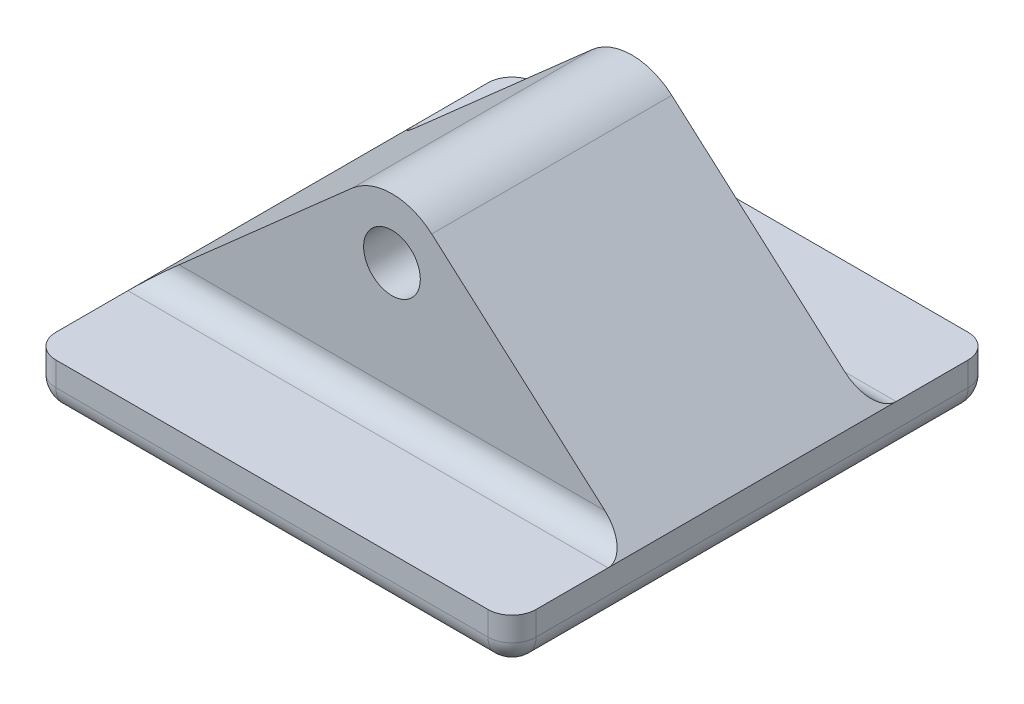
ISO-10303-21;
HEADER;
FILE_DESCRIPTION(('STEP AP214'),'2;1');
FILE_NAME('part.step','',(''),(''),'','','');
FILE_SCHEMA(('AUTOMOTIVE_DESIGN { 1 0 10303 214 1 1 1 1 }'));
ENDSEC;
DATA;
#1=APPLICATION_CONTEXT('core data for automotive mechanical design processes');
#2=APPLICATION_PROTOCOL_DEFINITION('international standard','automotive_design',2000,#1);
#3=PRODUCT_CONTEXT('',#1,'mechanical');
#4=PRODUCT('Part','Part','',(#3));
#5=PRODUCT_RELATED_PRODUCT_CATEGORY('part','',(#4));
#6=PRODUCT_DEFINITION_FORMATION('','',#4);
#7=PRODUCT_DEFINITION_CONTEXT('part definition',#1,'design');
#8=PRODUCT_DEFINITION('design','',#6,#7);
#9=PRODUCT_DEFINITION_SHAPE('','',#8);
#10=(LENGTH_UNIT() NAMED_UNIT(*) SI_UNIT(.MILLI.,.METRE.));
#11=(NAMED_UNIT(*) PLANE_ANGLE_UNIT() SI_UNIT($,.RADIAN.));
#12=(NAMED_UNIT(*) SI_UNIT($,.STERADIAN.) SOLID_ANGLE_UNIT());
#13=UNCERTAINTY_MEASURE_WITH_UNIT(LENGTH_MEASURE(1.E-05),#10,'distance_accuracy_value','');
#14=(GEOMETRIC_REPRESENTATION_CONTEXT(3) GLOBAL_UNCERTAINTY_ASSIGNED_CONTEXT((#13)) GLOBAL_UNIT_ASSIGNED_CONTEXT((#10,
#11,#12)) REPRESENTATION_CONTEXT('',''));
#15=CARTESIAN_POINT('',(0.,0.,0.));
#16=DIRECTION('',(0.,0.,1.));
#17=DIRECTION('',(1.,0.,0.));
#18=AXIS2_PLACEMENT_3D('',#15,#16,#17);
#19=CARTESIAN_POINT('',(0.,2.54,0.));
#20=DIRECTION('',(0.,-1.,0.));
#21=DIRECTION('',(0.,0.,-1.));
#22=AXIS2_PLACEMENT_3D('',#19,#20,#21);
#23=PLANE('',#22);
#24=DIRECTION('',(0.,0.,1.));
#25=VECTOR('',#24,1.);
#26=CARTESIAN_POINT('',(-12.7,2.54,12.7));
#27=LINE('',#26,#25);
#28=CARTESIAN_POINT('',(-12.7,2.54,7.62));
#29=VERTEX_POINT('',#28);
#30=CARTESIAN_POINT('',(-12.7,2.54,11.43));
#31=VERTEX_POINT('',#30);
#32=EDGE_CURVE('E317',#29,#31,#27,.T.);
#33=ORIENTED_EDGE('',*,*,#32,.T.);
#34=CARTESIAN_POINT('',(-11.43,2.54,11.43));
#35=DIRECTION('',(0.,-1.,0.));
#36=DIRECTION('',(0.,0.,-1.));
#37=AXIS2_PLACEMENT_3D('',#34,#35,#36);
#38=CIRCLE('',#37,1.27);
#39=CARTESIAN_POINT('',(-11.43,2.54,12.7));
#40=VERTEX_POINT('',#39);
#41=EDGE_CURVE('E283',#31,#40,#38,.F.);
#42=ORIENTED_EDGE('',*,*,#41,.T.);
#43=DIRECTION('',(1.,0.,0.));
#44=VECTOR('',#43,1.);
#45=CARTESIAN_POINT('',(-12.7,2.54,12.7));
#46=LINE('',#45,#44);
#47=CARTESIAN_POINT('',(11.43,2.54,12.7));
#48=VERTEX_POINT('',#47);
#49=EDGE_CURVE('E193',#40,#48,#46,.T.);
#50=ORIENTED_EDGE('',*,*,#49,.T.);
#51=CARTESIAN_POINT('',(11.43,2.54,11.43));
#52=DIRECTION('',(0.,-1.,0.));
#53=DIRECTION('',(0.,0.,-1.));
#54=AXIS2_PLACEMENT_3D('',#51,#52,#53);
#55=CIRCLE('',#54,1.27);
#56=CARTESIAN_POINT('',(12.7,2.54,11.43));
#57=VERTEX_POINT('',#56);
#58=EDGE_CURVE('E285',#48,#57,#55,.F.);
#59=ORIENTED_EDGE('',*,*,#58,.T.);
#60=DIRECTION('',(0.,0.,-1.));
#61=VECTOR('',#60,1.);
#62=CARTESIAN_POINT('',(12.7,2.54,12.7));
#63=LINE('',#62,#61);
#64=CARTESIAN_POINT('',(12.7,2.54,7.62));
#65=VERTEX_POINT('',#64);
#66=EDGE_CURVE('E297',#57,#65,#63,.T.);
#67=ORIENTED_EDGE('',*,*,#66,.T.);
#68=DIRECTION('',(1.,0.,0.));
#69=VECTOR('',#68,1.);
#70=CARTESIAN_POINT('',(-12.7,2.54,7.62));
#71=LINE('',#70,#69);
#72=EDGE_CURVE('E287',#65,#29,#71,.F.);
#73=ORIENTED_EDGE('',*,*,#72,.T.);
#74=EDGE_LOOP('',(#33,#42,#50,#59,#67,#73));
#75=FACE_BOUND('',#74,.T.);
#76=ADVANCED_FACE('F53',(#75),#23,.F.);
#77=DIRECTION('',(-1.,0.,0.));
#78=VECTOR('',#77,1.);
#79=CARTESIAN_POINT('',(-12.7,2.54,-12.7));
#80=LINE('',#79,#78);
#81=CARTESIAN_POINT('',(11.43,2.54,-12.7));
#82=VERTEX_POINT('',#81);
#83=CARTESIAN_POINT('',(-11.43,2.54,-12.7));
#84=VERTEX_POINT('',#83);
#85=EDGE_CURVE('E299',#82,#84,#80,.T.);
#86=ORIENTED_EDGE('',*,*,#85,.T.);
#87=CARTESIAN_POINT('',(-11.43,2.54,-11.43));
#88=DIRECTION('',(0.,-1.,0.));
#89=DIRECTION('',(0.,0.,-1.));
#90=AXIS2_PLACEMENT_3D('',#87,#88,#89);
#91=CIRCLE('',#90,1.27);
#92=CARTESIAN_POINT('',(-12.7,2.54,-11.43));
#93=VERTEX_POINT('',#92);
#94=EDGE_CURVE('E276',#84,#93,#91,.F.);
#95=ORIENTED_EDGE('',*,*,#94,.T.);
#96=CARTESIAN_POINT('',(-12.7,2.54,-7.62));
#97=VERTEX_POINT('',#96);
#98=EDGE_CURVE('E314',#93,#97,#27,.T.);
#99=ORIENTED_EDGE('',*,*,#98,.T.);
#100=DIRECTION('',(-1.,0.,0.));
#101=VECTOR('',#100,1.);
#102=CARTESIAN_POINT('',(12.7,2.54,-7.62));
#103=LINE('',#102,#101);
#104=CARTESIAN_POINT('',(12.7,2.54,-7.62));
#105=VERTEX_POINT('',#104);
#106=EDGE_CURVE('E280',#97,#105,#103,.F.);
#107=ORIENTED_EDGE('',*,*,#106,.T.);
#108=CARTESIAN_POINT('',(12.7,2.54,-11.43));
#109=VERTEX_POINT('',#108);
#110=EDGE_CURVE('E275',#105,#109,#63,.T.);
#111=ORIENTED_EDGE('',*,*,#110,.T.);
#112=CARTESIAN_POINT('',(11.43,2.54,-11.43));
#113=DIRECTION('',(0.,-1.,0.));
#114=DIRECTION('',(0.,0.,-1.));
#115=AXIS2_PLACEMENT_3D('',#112,#113,#114);
#116=CIRCLE('',#115,1.27);
#117=EDGE_CURVE('E278',#109,#82,#116,.F.);
#118=ORIENTED_EDGE('',*,*,#117,.T.);
#119=EDGE_LOOP('',(#86,#95,#99,#107,#111,#118));
#120=FACE_BOUND('',#119,.T.);
#121=ADVANCED_FACE('F395',(#120),#23,.F.);
#122=CARTESIAN_POINT('',(12.7,2.54,12.7));
#123=DIRECTION('',(-1.,0.,0.));
#124=DIRECTION('',(0.,0.,1.));
#125=AXIS2_PLACEMENT_3D('',#122,#123,#124);
#126=PLANE('',#125);
#127=ORIENTED_EDGE('',*,*,#66,.F.);
#128=DIRECTION('',(0.,-1.,0.));
#129=VECTOR('',#128,1.);
#130=CARTESIAN_POINT('',(12.7,2.54,11.43));
#131=LINE('',#130,#129);
#132=CARTESIAN_POINT('',(12.7,1.27,11.43));
#133=VERTEX_POINT('',#132);
#134=EDGE_CURVE('E290',#57,#133,#131,.T.);
#135=ORIENTED_EDGE('',*,*,#134,.T.);
#136=DIRECTION('',(0.,0.,-1.));
#137=VECTOR('',#136,1.);
#138=CARTESIAN_POINT('',(12.7,1.27,-12.7));
#139=LINE('',#138,#137);
#140=CARTESIAN_POINT('',(12.7,1.27,-11.43));
#141=VERTEX_POINT('',#140);
#142=EDGE_CURVE('E292',#133,#141,#139,.T.);
#143=ORIENTED_EDGE('',*,*,#142,.T.);
#144=DIRECTION('',(0.,-1.,0.));
#145=VECTOR('',#144,1.);
#146=CARTESIAN_POINT('',(12.7,2.54,-11.43));
#147=LINE('',#146,#145);
#148=EDGE_CURVE('E294',#141,#109,#147,.F.);
#149=ORIENTED_EDGE('',*,*,#148,.T.);
#150=ORIENTED_EDGE('',*,*,#110,.F.);
#151=DIRECTION('',(0.,0.,1.));
#152=VECTOR('',#151,1.);
#153=CARTESIAN_POINT('',(12.7,2.54,-12.700025));
#154=LINE('',#153,#152);
#155=EDGE_CURVE('E71',#105,#65,#154,.T.);
#156=ORIENTED_EDGE('',*,*,#155,.T.);
#157=EDGE_LOOP('',(#127,#135,#143,#149,#150,#156));
#158=FACE_BOUND('',#157,.T.);
#159=ADVANCED_FACE('F385',(#158),#126,.F.);
#160=CARTESIAN_POINT('',(-12.7,2.54,-12.7));
#161=DIRECTION('',(0.,0.,1.));
#162=DIRECTION('',(1.,0.,0.));
#163=AXIS2_PLACEMENT_3D('',#160,#161,#162);
#164=PLANE('',#163);
#165=DIRECTION('',(-1.,0.,0.));
#166=VECTOR('',#165,1.);
#167=CARTESIAN_POINT('',(-12.7,1.27,-12.7));
#168=LINE('',#167,#166);
#169=CARTESIAN_POINT('',(11.43,1.27,-12.7));
#170=VERTEX_POINT('',#169);
#171=CARTESIAN_POINT('',(-11.43,1.27,-12.7));
#172=VERTEX_POINT('',#171);
#173=EDGE_CURVE('E377',#170,#172,#168,.T.);
#174=ORIENTED_EDGE('',*,*,#173,.T.);
#175=DIRECTION('',(0.,-1.,0.));
#176=VECTOR('',#175,1.);
#177=CARTESIAN_POINT('',(-11.43,2.54,-12.7));
#178=LINE('',#177,#176);
#179=EDGE_CURVE('E354',#172,#84,#178,.F.);
#180=ORIENTED_EDGE('',*,*,#179,.T.);
#181=ORIENTED_EDGE('',*,*,#85,.F.);
#182=DIRECTION('',(0.,-1.,0.));
#183=VECTOR('',#182,1.);
#184=CARTESIAN_POINT('',(11.43,2.54,-12.7));
#185=LINE('',#184,#183);
#186=EDGE_CURVE('E199',#82,#170,#185,.T.);
#187=ORIENTED_EDGE('',*,*,#186,.T.);
#188=EDGE_LOOP('',(#174,#180,#181,#187));
#189=FACE_BOUND('',#188,.T.);
#190=ADVANCED_FACE('F378',(#189),#164,.F.);
#191=CARTESIAN_POINT('',(-12.7,2.54,12.7));
#192=DIRECTION('',(1.,0.,0.));
#193=DIRECTION('',(0.,0.,-1.));
#194=AXIS2_PLACEMENT_3D('',#191,#192,#193);
#195=PLANE('',#194);
#196=DIRECTION('',(0.,0.,1.));
#197=VECTOR('',#196,1.);
#198=CARTESIAN_POINT('',(-12.7,1.27,12.7));
#199=LINE('',#198,#197);
#200=CARTESIAN_POINT('',(-12.7,1.27,-11.43));
#201=VERTEX_POINT('',#200);
#202=CARTESIAN_POINT('',(-12.7,1.27,11.43));
#203=VERTEX_POINT('',#202);
#204=EDGE_CURVE('E309',#201,#203,#199,.T.);
#205=ORIENTED_EDGE('',*,*,#204,.T.);
#206=DIRECTION('',(0.,-1.,0.));
#207=VECTOR('',#206,1.);
#208=CARTESIAN_POINT('',(-12.7,2.54,11.43));
#209=LINE('',#208,#207);
#210=EDGE_CURVE('E307',#203,#31,#209,.F.);
#211=ORIENTED_EDGE('',*,*,#210,.T.);
#212=ORIENTED_EDGE('',*,*,#32,.F.);
#213=DIRECTION('',(0.,0.,1.));
#214=VECTOR('',#213,1.);
#215=CARTESIAN_POINT('',(-12.7,2.54,-12.700025));
#216=LINE('',#215,#214);
#217=EDGE_CURVE('E260',#97,#29,#216,.T.);
#218=ORIENTED_EDGE('',*,*,#217,.F.);
#219=ORIENTED_EDGE('',*,*,#98,.F.);
#220=DIRECTION('',(0.,-1.,0.));
#221=VECTOR('',#220,1.);
#222=CARTESIAN_POINT('',(-12.7,2.54,-11.43));
#223=LINE('',#222,#221);
#224=EDGE_CURVE('E311',#93,#201,#223,.T.);
#225=ORIENTED_EDGE('',*,*,#224,.T.);
#226=EDGE_LOOP('',(#205,#211,#212,#218,#219,#225));
#227=FACE_BOUND('',#226,.T.);
#228=ADVANCED_FACE('F394',(#227),#195,.F.);
#229=CARTESIAN_POINT('',(-12.7,2.54,12.7));
#230=DIRECTION('',(0.,0.,-1.));
#231=DIRECTION('',(-1.,0.,0.));
#232=AXIS2_PLACEMENT_3D('',#229,#230,#231);
#233=PLANE('',#232);
#234=ORIENTED_EDGE('',*,*,#49,.F.);
#235=DIRECTION('',(0.,-1.,0.));
#236=VECTOR('',#235,1.);
#237=CARTESIAN_POINT('',(-11.43,2.54,12.7));
#238=LINE('',#237,#236);
#239=CARTESIAN_POINT('',(-11.43,1.27,12.7));
#240=VERTEX_POINT('',#239);
#241=EDGE_CURVE('E296',#40,#240,#238,.T.);
#242=ORIENTED_EDGE('',*,*,#241,.T.);
#243=DIRECTION('',(1.,0.,0.));
#244=VECTOR('',#243,1.);
#245=CARTESIAN_POINT('',(12.7,1.27,12.7));
#246=LINE('',#245,#244);
#247=CARTESIAN_POINT('',(11.43,1.27,12.7));
#248=VERTEX_POINT('',#247);
#249=EDGE_CURVE('E303',#240,#248,#246,.T.);
#250=ORIENTED_EDGE('',*,*,#249,.T.);
#251=DIRECTION('',(0.,-1.,0.));
#252=VECTOR('',#251,1.);
#253=CARTESIAN_POINT('',(11.43,2.54,12.7));
#254=LINE('',#253,#252);
#255=EDGE_CURVE('E305',#248,#48,#254,.F.);
#256=ORIENTED_EDGE('',*,*,#255,.T.);
#257=EDGE_LOOP('',(#234,#242,#250,#256));
#258=FACE_BOUND('',#257,.T.);
#259=ADVANCED_FACE('F341',(#258),#233,.F.);
#260=CARTESIAN_POINT('',(0.,0.,0.));
#261=DIRECTION('',(0.,-1.,0.));
#262=DIRECTION('',(0.,0.,-1.));
#263=AXIS2_PLACEMENT_3D('',#260,#261,#262);
#264=PLANE('',#263);
#265=DIRECTION('',(0.,0.,1.));
#266=VECTOR('',#265,1.);
#267=CARTESIAN_POINT('',(-11.43,0.,-12.7));
#268=LINE('',#267,#266);
#269=CARTESIAN_POINT('',(-11.43,0.,11.43));
#270=VERTEX_POINT('',#269);
#271=CARTESIAN_POINT('',(-11.43,0.,-11.43));
#272=VERTEX_POINT('',#271);
#273=EDGE_CURVE('E350',#270,#272,#268,.F.);
#274=ORIENTED_EDGE('',*,*,#273,.T.);
#275=DIRECTION('',(-1.,0.,0.));
#276=VECTOR('',#275,1.);
#277=CARTESIAN_POINT('',(12.7,0.,-11.43));
#278=LINE('',#277,#276);
#279=CARTESIAN_POINT('',(11.43,0.,-11.43));
#280=VERTEX_POINT('',#279);
#281=EDGE_CURVE('E313',#272,#280,#278,.F.);
#282=ORIENTED_EDGE('',*,*,#281,.T.);
#283=DIRECTION('',(0.,0.,-1.));
#284=VECTOR('',#283,1.);
#285=CARTESIAN_POINT('',(11.43,0.,12.7));
#286=LINE('',#285,#284);
#287=CARTESIAN_POINT('',(11.43,0.,11.43));
#288=VERTEX_POINT('',#287);
#289=EDGE_CURVE('E351',#280,#288,#286,.F.);
#290=ORIENTED_EDGE('',*,*,#289,.T.);
#291=DIRECTION('',(1.,0.,0.));
#292=VECTOR('',#291,1.);
#293=CARTESIAN_POINT('',(-12.7,0.,11.43));
#294=LINE('',#293,#292);
#295=EDGE_CURVE('E348',#288,#270,#294,.F.);
#296=ORIENTED_EDGE('',*,*,#295,.T.);
#297=EDGE_LOOP('',(#274,#282,#290,#296));
#298=FACE_BOUND('',#297,.T.);
#299=ADVANCED_FACE('F359',(#298),#264,.T.);
#300=CARTESIAN_POINT('',(-12.7,15.24,-6.35));
#301=DIRECTION('',(0.,0.,1.));
#302=DIRECTION('',(1.,0.,0.));
#303=AXIS2_PLACEMENT_3D('',#300,#301,#302);
#304=PLANE('',#303);
#305=CARTESIAN_POINT('',(0.,9.525,-6.35));
#306=DIRECTION('',(0.,0.,1.));
#307=DIRECTION('',(1.,0.,0.));
#308=AXIS2_PLACEMENT_3D('',#305,#306,#307);
#309=CIRCLE('',#308,1.5);
#310=CARTESIAN_POINT('',(1.5,9.525,-6.35));
#311=VERTEX_POINT('',#310);
#312=EDGE_CURVE('E204',#311,#311,#309,.T.);
#313=ORIENTED_EDGE('',*,*,#312,.T.);
#314=EDGE_LOOP('',(#313));
#315=FACE_BOUND('',#314,.T.);
#316=DIRECTION('',(0.749368808112096,-0.662152844461652,0.));
#317=VECTOR('',#316,1.);
#318=CARTESIAN_POINT('',(-7.86515964410884,20.7116650169374,-6.35));
#319=LINE('',#318,#317);
#320=CARTESIAN_POINT('',(2.10233528116574,11.9042459657559,-6.35));
#321=VERTEX_POINT('',#320);
#322=CARTESIAN_POINT('',(11.2627209876654,3.81,-6.35));
#323=VERTEX_POINT('',#322);
#324=EDGE_CURVE('E170',#321,#323,#319,.T.);
#325=ORIENTED_EDGE('',*,*,#324,.T.);
#326=DIRECTION('',(-1.,0.,0.));
#327=VECTOR('',#326,1.);
#328=CARTESIAN_POINT('',(-12.7,3.81,-6.35));
#329=LINE('',#328,#327);
#330=CARTESIAN_POINT('',(-11.2627209876654,3.81,-6.35));
#331=VERTEX_POINT('',#330);
#332=EDGE_CURVE('E205',#323,#331,#329,.T.);
#333=ORIENTED_EDGE('',*,*,#332,.T.);
#334=DIRECTION('',(0.749368808112095,0.662152844461653,0.));
#335=VECTOR('',#334,1.);
#336=CARTESIAN_POINT('',(-6.39830206440327,8.10826914574395,-6.35));
#337=LINE('',#336,#335);
#338=CARTESIAN_POINT('',(-2.10233528116574,11.9042459657559,-6.35));
#339=VERTEX_POINT('',#338);
#340=EDGE_CURVE('E267',#331,#339,#337,.T.);
#341=ORIENTED_EDGE('',*,*,#340,.T.);
#342=CARTESIAN_POINT('',(0.,9.525,-6.35));
#343=DIRECTION('',(0.,0.,1.));
#344=DIRECTION('',(1.,0.,0.));
#345=AXIS2_PLACEMENT_3D('',#342,#343,#344);
#346=CIRCLE('',#345,3.175);
#347=EDGE_CURVE('E264',#339,#321,#346,.F.);
#348=ORIENTED_EDGE('',*,*,#347,.T.);
#349=EDGE_LOOP('',(#325,#333,#341,#348));
#350=FACE_BOUND('',#349,.T.);
#351=ADVANCED_FACE('F403',(#315,#350),#304,.F.);
#352=CARTESIAN_POINT('',(-12.7,15.24,6.35));
#353=DIRECTION('',(0.,0.,-1.));
#354=DIRECTION('',(-1.,0.,0.));
#355=AXIS2_PLACEMENT_3D('',#352,#353,#354);
#356=PLANE('',#355);
#357=CARTESIAN_POINT('',(0.,9.525,6.35));
#358=DIRECTION('',(0.,0.,1.));
#359=DIRECTION('',(1.,0.,0.));
#360=AXIS2_PLACEMENT_3D('',#357,#358,#359);
#361=CIRCLE('',#360,1.5);
#362=CARTESIAN_POINT('',(1.5,9.525,6.35));
#363=VERTEX_POINT('',#362);
#364=EDGE_CURVE('E247',#363,#363,#361,.T.);
#365=ORIENTED_EDGE('',*,*,#364,.F.);
#366=EDGE_LOOP('',(#365));
#367=FACE_BOUND('',#366,.T.);
#368=DIRECTION('',(0.749368808112095,0.662152844461653,0.));
#369=VECTOR('',#368,1.);
#370=CARTESIAN_POINT('',(-6.8286087328633,7.72804410644794,6.35));
#371=LINE('',#370,#369);
#372=CARTESIAN_POINT('',(-11.2627209876654,3.81,6.35));
#373=VERTEX_POINT('',#372);
#374=CARTESIAN_POINT('',(-2.10233528116574,11.9042459657559,6.35));
#375=VERTEX_POINT('',#374);
#376=EDGE_CURVE('E183',#373,#375,#371,.T.);
#377=ORIENTED_EDGE('',*,*,#376,.F.);
#378=DIRECTION('',(1.,0.,0.));
#379=VECTOR('',#378,1.);
#380=CARTESIAN_POINT('',(12.7,3.81,6.35));
#381=LINE('',#380,#379);
#382=CARTESIAN_POINT('',(11.2627209876654,3.81,6.35));
#383=VERTEX_POINT('',#382);
#384=EDGE_CURVE('E188',#373,#383,#381,.T.);
#385=ORIENTED_EDGE('',*,*,#384,.T.);
#386=DIRECTION('',(0.749368808112096,-0.662152844461652,0.));
#387=VECTOR('',#386,1.);
#388=CARTESIAN_POINT('',(6.82860873286329,7.72804410644794,6.35));
#389=LINE('',#388,#387);
#390=CARTESIAN_POINT('',(2.10233528116574,11.9042459657559,6.35));
#391=VERTEX_POINT('',#390);
#392=EDGE_CURVE('E168',#391,#383,#389,.T.);
#393=ORIENTED_EDGE('',*,*,#392,.F.);
#394=CARTESIAN_POINT('',(0.,9.525,6.35));
#395=DIRECTION('',(0.,0.,1.));
#396=DIRECTION('',(1.,0.,0.));
#397=AXIS2_PLACEMENT_3D('',#394,#395,#396);
#398=CIRCLE('',#397,3.175);
#399=EDGE_CURVE('E178',#375,#391,#398,.F.);
#400=ORIENTED_EDGE('',*,*,#399,.F.);
#401=EDGE_LOOP('',(#377,#385,#393,#400));
#402=FACE_BOUND('',#401,.T.);
#403=ADVANCED_FACE('F186',(#367,#402),#356,.F.);
#404=CARTESIAN_POINT('',(-6.8286087328633,7.72804410644794,-12.700025));
#405=DIRECTION('',(0.662152844461653,-0.749368808112095,0.));
#406=DIRECTION('',(0.749368808112095,0.662152844461653,0.));
#407=AXIS2_PLACEMENT_3D('',#404,#405,#406);
#408=PLANE('',#407);
#409=ORIENTED_EDGE('',*,*,#217,.T.);
#410=CARTESIAN_POINT('',(-11.2627209876654,3.81,7.62));
#411=DIRECTION('',(0.662152844461653,-0.749368808112095,0.));
#412=DIRECTION('',(-0.749368808112095,-0.662152844461653,0.));
#413=AXIS2_PLACEMENT_3D('',#410,#411,#412);
#414=ELLIPSE('',#413,1.91798617286398,1.27);
#415=EDGE_CURVE('E12',#29,#373,#414,.T.);
#416=ORIENTED_EDGE('',*,*,#415,.T.);
#417=ORIENTED_EDGE('',*,*,#376,.T.);
#418=DIRECTION('',(0.,0.,1.));
#419=VECTOR('',#418,1.);
#420=CARTESIAN_POINT('',(-2.10233528116574,11.9042459657559,-12.700025));
#421=LINE('',#420,#419);
#422=EDGE_CURVE('E174',#339,#375,#421,.T.);
#423=ORIENTED_EDGE('',*,*,#422,.F.);
#424=ORIENTED_EDGE('',*,*,#340,.F.);
#425=CARTESIAN_POINT('',(-11.2627209876654,3.81,-7.62));
#426=DIRECTION('',(0.662152844461653,-0.749368808112095,0.));
#427=DIRECTION('',(0.749368808112095,0.662152844461653,0.));
#428=AXIS2_PLACEMENT_3D('',#425,#426,#427);
#429=ELLIPSE('',#428,1.91798617286398,1.27);
#430=EDGE_CURVE('E208',#331,#97,#429,.T.);
#431=ORIENTED_EDGE('',*,*,#430,.T.);
#432=EDGE_LOOP('',(#409,#416,#417,#423,#424,#431));
#433=FACE_BOUND('',#432,.T.);
#434=ADVANCED_FACE('F390',(#433),#408,.F.);
#435=CARTESIAN_POINT('',(6.82860873286329,7.72804410644794,-12.700025));
#436=DIRECTION('',(-0.662152844461652,-0.749368808112096,0.));
#437=DIRECTION('',(0.749368808112096,-0.662152844461652,0.));
#438=AXIS2_PLACEMENT_3D('',#435,#436,#437);
#439=PLANE('',#438);
#440=DIRECTION('',(0.,0.,1.));
#441=VECTOR('',#440,1.);
#442=CARTESIAN_POINT('',(2.10233528116574,11.9042459657559,-12.700025));
#443=LINE('',#442,#441);
#444=EDGE_CURVE('E163',#321,#391,#443,.T.);
#445=ORIENTED_EDGE('',*,*,#444,.T.);
#446=ORIENTED_EDGE('',*,*,#392,.T.);
#447=CARTESIAN_POINT('',(11.2627209876654,3.81,7.62));
#448=DIRECTION('',(-0.662152844461652,-0.749368808112096,0.));
#449=DIRECTION('',(-0.749368808112096,0.662152844461652,0.));
#450=AXIS2_PLACEMENT_3D('',#447,#448,#449);
#451=ELLIPSE('',#450,1.91798617286398,1.27);
#452=EDGE_CURVE('E63',#383,#65,#451,.T.);
#453=ORIENTED_EDGE('',*,*,#452,.T.);
#454=ORIENTED_EDGE('',*,*,#155,.F.);
#455=CARTESIAN_POINT('',(11.2627209876654,3.81,-7.62));
#456=DIRECTION('',(-0.662152844461652,-0.749368808112096,0.));
#457=DIRECTION('',(0.749368808112096,-0.662152844461652,0.));
#458=AXIS2_PLACEMENT_3D('',#455,#456,#457);
#459=ELLIPSE('',#458,1.91798617286398,1.27);
#460=EDGE_CURVE('E211',#105,#323,#459,.T.);
#461=ORIENTED_EDGE('',*,*,#460,.T.);
#462=ORIENTED_EDGE('',*,*,#324,.F.);
#463=EDGE_LOOP('',(#445,#446,#453,#454,#461,#462));
#464=FACE_BOUND('',#463,.T.);
#465=ADVANCED_FACE('F165',(#464),#439,.F.);
#466=CARTESIAN_POINT('',(0.,9.525,-12.700025));
#467=DIRECTION('',(0.,0.,1.));
#468=DIRECTION('',(1.,0.,0.));
#469=AXIS2_PLACEMENT_3D('',#466,#467,#468);
#470=CYLINDRICAL_SURFACE('',#469,3.175);
#471=ORIENTED_EDGE('',*,*,#422,.T.);
#472=ORIENTED_EDGE('',*,*,#399,.T.);
#473=ORIENTED_EDGE('',*,*,#444,.F.);
#474=ORIENTED_EDGE('',*,*,#347,.F.);
#475=EDGE_LOOP('',(#471,#472,#473,#474));
#476=FACE_BOUND('',#475,.T.);
#477=ADVANCED_FACE('F179',(#476),#470,.T.);
#478=CARTESIAN_POINT('',(0.,9.525,-12.700025));
#479=DIRECTION('',(0.,0.,1.));
#480=DIRECTION('',(1.,0.,0.));
#481=AXIS2_PLACEMENT_3D('',#478,#479,#480);
#482=CYLINDRICAL_SURFACE('',#481,1.5);
#483=ORIENTED_EDGE('',*,*,#364,.T.);
#484=EDGE_LOOP('',(#483));
#485=FACE_BOUND('',#484,.T.);
#486=ORIENTED_EDGE('',*,*,#312,.F.);
#487=EDGE_LOOP('',(#486));
#488=FACE_BOUND('',#487,.T.);
#489=ADVANCED_FACE('F462',(#485,#488),#482,.F.);
#490=CARTESIAN_POINT('',(11.43,2.54,11.43));
#491=DIRECTION('',(0.,-1.,0.));
#492=DIRECTION('',(0.,0.,-1.));
#493=AXIS2_PLACEMENT_3D('',#490,#491,#492);
#494=CYLINDRICAL_SURFACE('',#493,1.27);
#495=ORIENTED_EDGE('',*,*,#58,.F.);
#496=ORIENTED_EDGE('',*,*,#255,.F.);
#497=CARTESIAN_POINT('',(11.43,1.27,11.43));
#498=DIRECTION('',(0.,-1.,0.));
#499=DIRECTION('',(0.,0.,-1.));
#500=AXIS2_PLACEMENT_3D('',#497,#498,#499);
#501=CIRCLE('',#500,1.27);
#502=EDGE_CURVE('E241',#133,#248,#501,.T.);
#503=ORIENTED_EDGE('',*,*,#502,.F.);
#504=ORIENTED_EDGE('',*,*,#134,.F.);
#505=EDGE_LOOP('',(#495,#496,#503,#504));
#506=FACE_BOUND('',#505,.T.);
#507=ADVANCED_FACE('F384',(#506),#494,.T.);
#508=CARTESIAN_POINT('',(-11.43,2.54,11.43));
#509=DIRECTION('',(0.,-1.,0.));
#510=DIRECTION('',(0.,0.,-1.));
#511=AXIS2_PLACEMENT_3D('',#508,#509,#510);
#512=CYLINDRICAL_SURFACE('',#511,1.27);
#513=ORIENTED_EDGE('',*,*,#41,.F.);
#514=ORIENTED_EDGE('',*,*,#210,.F.);
#515=CARTESIAN_POINT('',(-11.43,1.27,11.43));
#516=DIRECTION('',(0.,-1.,0.));
#517=DIRECTION('',(0.,0.,-1.));
#518=AXIS2_PLACEMENT_3D('',#515,#516,#517);
#519=CIRCLE('',#518,1.27);
#520=EDGE_CURVE('E239',#240,#203,#519,.T.);
#521=ORIENTED_EDGE('',*,*,#520,.F.);
#522=ORIENTED_EDGE('',*,*,#241,.F.);
#523=EDGE_LOOP('',(#513,#514,#521,#522));
#524=FACE_BOUND('',#523,.T.);
#525=ADVANCED_FACE('F337',(#524),#512,.T.);
#526=CARTESIAN_POINT('',(-12.7,1.27,11.43));
#527=DIRECTION('',(-1.,0.,0.));
#528=DIRECTION('',(0.,0.,1.));
#529=AXIS2_PLACEMENT_3D('',#526,#527,#528);
#530=CYLINDRICAL_SURFACE('',#529,1.27);
#531=CARTESIAN_POINT('',(11.43,1.27,11.43));
#532=DIRECTION('',(1.,0.,0.));
#533=DIRECTION('',(0.,0.,-1.));
#534=AXIS2_PLACEMENT_3D('',#531,#532,#533);
#535=CIRCLE('',#534,1.27);
#536=EDGE_CURVE('E57',#248,#288,#535,.T.);
#537=ORIENTED_EDGE('',*,*,#536,.F.);
#538=ORIENTED_EDGE('',*,*,#249,.F.);
#539=CARTESIAN_POINT('',(-11.43,1.27,11.43));
#540=DIRECTION('',(-1.,0.,0.));
#541=DIRECTION('',(0.,0.,1.));
#542=AXIS2_PLACEMENT_3D('',#539,#540,#541);
#543=CIRCLE('',#542,1.27);
#544=EDGE_CURVE('E236',#270,#240,#543,.T.);
#545=ORIENTED_EDGE('',*,*,#544,.F.);
#546=ORIENTED_EDGE('',*,*,#295,.F.);
#547=EDGE_LOOP('',(#537,#538,#545,#546));
#548=FACE_BOUND('',#547,.T.);
#549=ADVANCED_FACE('F345',(#548),#530,.T.);
#550=CARTESIAN_POINT('',(11.43,1.27,11.43));
#551=DIRECTION('',(0.,0.,1.));
#552=DIRECTION('',(1.,0.,0.));
#553=AXIS2_PLACEMENT_3D('',#550,#551,#552);
#554=SPHERICAL_SURFACE('',#553,1.27);
#555=ORIENTED_EDGE('',*,*,#502,.T.);
#556=ORIENTED_EDGE('',*,*,#536,.T.);
#557=CARTESIAN_POINT('',(11.43,1.27,11.43));
#558=DIRECTION('',(0.,0.,1.));
#559=DIRECTION('',(1.,0.,0.));
#560=AXIS2_PLACEMENT_3D('',#557,#558,#559);
#561=CIRCLE('',#560,1.27);
#562=EDGE_CURVE('E233',#133,#288,#561,.F.);
#563=ORIENTED_EDGE('',*,*,#562,.F.);
#564=EDGE_LOOP('',(#555,#556,#563));
#565=FACE_BOUND('',#564,.T.);
#566=ADVANCED_FACE('F453',(#565),#554,.T.);
#567=CARTESIAN_POINT('',(-11.43,1.27,11.43));
#568=DIRECTION('',(0.,0.,1.));
#569=DIRECTION('',(1.,0.,0.));
#570=AXIS2_PLACEMENT_3D('',#567,#568,#569);
#571=SPHERICAL_SURFACE('',#570,1.27);
#572=ORIENTED_EDGE('',*,*,#544,.T.);
#573=ORIENTED_EDGE('',*,*,#520,.T.);
#574=CARTESIAN_POINT('',(-11.43,1.27,11.43));
#575=DIRECTION('',(0.,0.,1.));
#576=DIRECTION('',(1.,0.,0.));
#577=AXIS2_PLACEMENT_3D('',#574,#575,#576);
#578=CIRCLE('',#577,1.27);
#579=EDGE_CURVE('E230',#270,#203,#578,.F.);
#580=ORIENTED_EDGE('',*,*,#579,.F.);
#581=EDGE_LOOP('',(#572,#573,#580));
#582=FACE_BOUND('',#581,.T.);
#583=ADVANCED_FACE('F449',(#582),#571,.T.);
#584=CARTESIAN_POINT('',(11.43,1.27,12.7));
#585=DIRECTION('',(0.,0.,1.));
#586=DIRECTION('',(1.,0.,0.));
#587=AXIS2_PLACEMENT_3D('',#584,#585,#586);
#588=CYLINDRICAL_SURFACE('',#587,1.27);
#589=ORIENTED_EDGE('',*,*,#562,.T.);
#590=ORIENTED_EDGE('',*,*,#289,.F.);
#591=CARTESIAN_POINT('',(11.43,1.27,-11.43));
#592=DIRECTION('',(0.,0.,-1.));
#593=DIRECTION('',(-1.,0.,0.));
#594=AXIS2_PLACEMENT_3D('',#591,#592,#593);
#595=CIRCLE('',#594,1.27);
#596=EDGE_CURVE('E227',#141,#280,#595,.T.);
#597=ORIENTED_EDGE('',*,*,#596,.F.);
#598=ORIENTED_EDGE('',*,*,#142,.F.);
#599=EDGE_LOOP('',(#589,#590,#597,#598));
#600=FACE_BOUND('',#599,.T.);
#601=ADVANCED_FACE('F445',(#600),#588,.T.);
#602=CARTESIAN_POINT('',(11.43,2.54,-11.43));
#603=DIRECTION('',(0.,-1.,0.));
#604=DIRECTION('',(0.,0.,-1.));
#605=AXIS2_PLACEMENT_3D('',#602,#603,#604);
#606=CYLINDRICAL_SURFACE('',#605,1.27);
#607=ORIENTED_EDGE('',*,*,#117,.F.);
#608=ORIENTED_EDGE('',*,*,#148,.F.);
#609=CARTESIAN_POINT('',(11.43,1.27,-11.43));
#610=DIRECTION('',(0.,-1.,0.));
#611=DIRECTION('',(0.,0.,-1.));
#612=AXIS2_PLACEMENT_3D('',#609,#610,#611);
#613=CIRCLE('',#612,1.27);
#614=EDGE_CURVE('E224',#170,#141,#613,.T.);
#615=ORIENTED_EDGE('',*,*,#614,.F.);
#616=ORIENTED_EDGE('',*,*,#186,.F.);
#617=EDGE_LOOP('',(#607,#608,#615,#616));
#618=FACE_BOUND('',#617,.T.);
#619=ADVANCED_FACE('F442',(#618),#606,.T.);
#620=CARTESIAN_POINT('',(-11.43,2.54,-11.43));
#621=DIRECTION('',(0.,-1.,0.));
#622=DIRECTION('',(0.,0.,-1.));
#623=AXIS2_PLACEMENT_3D('',#620,#621,#622);
#624=CYLINDRICAL_SURFACE('',#623,1.27);
#625=ORIENTED_EDGE('',*,*,#94,.F.);
#626=ORIENTED_EDGE('',*,*,#179,.F.);
#627=CARTESIAN_POINT('',(-11.43,1.27,-11.43));
#628=DIRECTION('',(0.,-1.,0.));
#629=DIRECTION('',(0.,0.,-1.));
#630=AXIS2_PLACEMENT_3D('',#627,#628,#629);
#631=CIRCLE('',#630,1.27);
#632=EDGE_CURVE('E221',#201,#172,#631,.T.);
#633=ORIENTED_EDGE('',*,*,#632,.F.);
#634=ORIENTED_EDGE('',*,*,#224,.F.);
#635=EDGE_LOOP('',(#625,#626,#633,#634));
#636=FACE_BOUND('',#635,.T.);
#637=ADVANCED_FACE('F375',(#636),#624,.T.);
#638=CARTESIAN_POINT('',(-11.43,1.27,12.7));
#639=DIRECTION('',(0.,0.,-1.));
#640=DIRECTION('',(-1.,0.,0.));
#641=AXIS2_PLACEMENT_3D('',#638,#639,#640);
#642=CYLINDRICAL_SURFACE('',#641,1.27);
#643=ORIENTED_EDGE('',*,*,#579,.T.);
#644=ORIENTED_EDGE('',*,*,#204,.F.);
#645=CARTESIAN_POINT('',(-11.43,1.27,-11.43));
#646=DIRECTION('',(0.,0.,-1.));
#647=DIRECTION('',(-1.,0.,0.));
#648=AXIS2_PLACEMENT_3D('',#645,#646,#647);
#649=CIRCLE('',#648,1.27);
#650=EDGE_CURVE('E218',#272,#201,#649,.T.);
#651=ORIENTED_EDGE('',*,*,#650,.F.);
#652=ORIENTED_EDGE('',*,*,#273,.F.);
#653=EDGE_LOOP('',(#643,#644,#651,#652));
#654=FACE_BOUND('',#653,.T.);
#655=ADVANCED_FACE('F435',(#654),#642,.T.);
#656=CARTESIAN_POINT('',(11.43,1.27,-11.43));
#657=DIRECTION('',(0.,0.,1.));
#658=DIRECTION('',(1.,0.,0.));
#659=AXIS2_PLACEMENT_3D('',#656,#657,#658);
#660=SPHERICAL_SURFACE('',#659,1.27);
#661=ORIENTED_EDGE('',*,*,#614,.T.);
#662=ORIENTED_EDGE('',*,*,#596,.T.);
#663=CARTESIAN_POINT('',(11.43,1.27,-11.43));
#664=DIRECTION('',(1.,0.,0.));
#665=DIRECTION('',(0.,0.,-1.));
#666=AXIS2_PLACEMENT_3D('',#663,#664,#665);
#667=CIRCLE('',#666,1.27);
#668=EDGE_CURVE('E216',#170,#280,#667,.F.);
#669=ORIENTED_EDGE('',*,*,#668,.F.);
#670=EDGE_LOOP('',(#661,#662,#669));
#671=FACE_BOUND('',#670,.T.);
#672=ADVANCED_FACE('F432',(#671),#660,.T.);
#673=CARTESIAN_POINT('',(-11.43,1.27,-11.43));
#674=DIRECTION('',(0.,0.,1.));
#675=DIRECTION('',(1.,0.,0.));
#676=AXIS2_PLACEMENT_3D('',#673,#674,#675);
#677=SPHERICAL_SURFACE('',#676,1.27);
#678=ORIENTED_EDGE('',*,*,#650,.T.);
#679=ORIENTED_EDGE('',*,*,#632,.T.);
#680=CARTESIAN_POINT('',(-11.43,1.27,-11.43));
#681=DIRECTION('',(-1.,0.,0.));
#682=DIRECTION('',(0.,0.,1.));
#683=AXIS2_PLACEMENT_3D('',#680,#681,#682);
#684=CIRCLE('',#683,1.27);
#685=EDGE_CURVE('E214',#272,#172,#684,.F.);
#686=ORIENTED_EDGE('',*,*,#685,.F.);
#687=EDGE_LOOP('',(#678,#679,#686));
#688=FACE_BOUND('',#687,.T.);
#689=ADVANCED_FACE('F369',(#688),#677,.T.);
#690=CARTESIAN_POINT('',(-12.7,1.27,-11.43));
#691=DIRECTION('',(1.,0.,0.));
#692=DIRECTION('',(0.,0.,-1.));
#693=AXIS2_PLACEMENT_3D('',#690,#691,#692);
#694=CYLINDRICAL_SURFACE('',#693,1.27);
#695=ORIENTED_EDGE('',*,*,#668,.T.);
#696=ORIENTED_EDGE('',*,*,#281,.F.);
#697=ORIENTED_EDGE('',*,*,#685,.T.);
#698=ORIENTED_EDGE('',*,*,#173,.F.);
#699=EDGE_LOOP('',(#695,#696,#697,#698));
#700=FACE_BOUND('',#699,.T.);
#701=ADVANCED_FACE('F365',(#700),#694,.T.);
#702=CARTESIAN_POINT('',(-12.7,3.81,-7.62));
#703=DIRECTION('',(1.,0.,0.));
#704=DIRECTION('',(0.,0.,-1.));
#705=AXIS2_PLACEMENT_3D('',#702,#703,#704);
#706=CYLINDRICAL_SURFACE('',#705,1.27);
#707=ORIENTED_EDGE('',*,*,#460,.F.);
#708=ORIENTED_EDGE('',*,*,#106,.F.);
#709=ORIENTED_EDGE('',*,*,#430,.F.);
#710=ORIENTED_EDGE('',*,*,#332,.F.);
#711=EDGE_LOOP('',(#707,#708,#709,#710));
#712=FACE_BOUND('',#711,.T.);
#713=ADVANCED_FACE('F400',(#712),#706,.F.);
#714=CARTESIAN_POINT('',(-12.7,3.81,7.62));
#715=DIRECTION('',(-1.,0.,0.));
#716=DIRECTION('',(0.,0.,1.));
#717=AXIS2_PLACEMENT_3D('',#714,#715,#716);
#718=CYLINDRICAL_SURFACE('',#717,1.27);
#719=ORIENTED_EDGE('',*,*,#415,.F.);
#720=ORIENTED_EDGE('',*,*,#72,.F.);
#721=ORIENTED_EDGE('',*,*,#452,.F.);
#722=ORIENTED_EDGE('',*,*,#384,.F.);
#723=EDGE_LOOP('',(#719,#720,#721,#722));
#724=FACE_BOUND('',#723,.T.);
#725=ADVANCED_FACE('F55',(#724),#718,.F.);
#726=CLOSED_SHELL('',(#76,#121,#159,#190,#228,#259,#299,#351,#403,#434,#465,#477,#489,#507,#525,
#549,#566,#583,#601,#619,#637,#655,#672,#689,#701,#713,#725));
#727=MANIFOLD_SOLID_BREP('B2',#726);
#728=ADVANCED_BREP_SHAPE_REPRESENTATION('',(#18,#727),#14);
#729=SHAPE_DEFINITION_REPRESENTATION(#9,#728);
ENDSEC;
END-ISO-10303-21;
